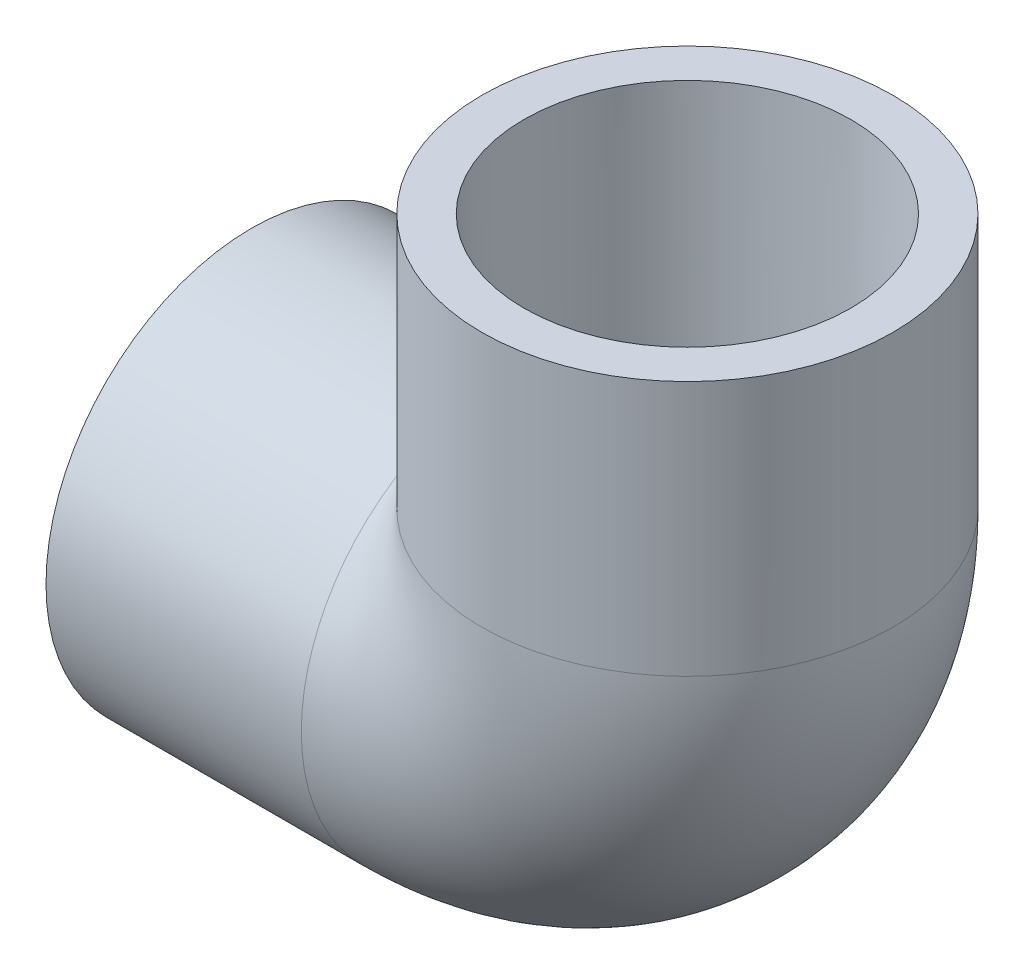
ISO-10303-21;
HEADER;
FILE_DESCRIPTION(('STEP AP214'),'2;1');
FILE_NAME('part.step','',(''),(''),'','','');
FILE_SCHEMA(('AUTOMOTIVE_DESIGN { 1 0 10303 214 1 1 1 1 }'));
ENDSEC;
DATA;
#1=APPLICATION_CONTEXT('core data for automotive mechanical design processes');
#2=APPLICATION_PROTOCOL_DEFINITION('international standard','automotive_design',2000,#1);
#3=PRODUCT_CONTEXT('',#1,'mechanical');
#4=PRODUCT('Part','Part','',(#3));
#5=PRODUCT_RELATED_PRODUCT_CATEGORY('part','',(#4));
#6=PRODUCT_DEFINITION_FORMATION('','',#4);
#7=PRODUCT_DEFINITION_CONTEXT('part definition',#1,'design');
#8=PRODUCT_DEFINITION('design','',#6,#7);
#9=PRODUCT_DEFINITION_SHAPE('','',#8);
#10=(LENGTH_UNIT() NAMED_UNIT(*) SI_UNIT(.MILLI.,.METRE.));
#11=(NAMED_UNIT(*) PLANE_ANGLE_UNIT() SI_UNIT($,.RADIAN.));
#12=(NAMED_UNIT(*) SI_UNIT($,.STERADIAN.) SOLID_ANGLE_UNIT());
#13=UNCERTAINTY_MEASURE_WITH_UNIT(LENGTH_MEASURE(1.E-05),#10,'distance_accuracy_value','');
#14=(GEOMETRIC_REPRESENTATION_CONTEXT(3) GLOBAL_UNCERTAINTY_ASSIGNED_CONTEXT((#13)) GLOBAL_UNIT_ASSIGNED_CONTEXT((#10,
#11,#12)) REPRESENTATION_CONTEXT('',''));
#15=CARTESIAN_POINT('',(0.,0.,0.));
#16=DIRECTION('',(0.,0.,1.));
#17=DIRECTION('',(1.,0.,0.));
#18=AXIS2_PLACEMENT_3D('',#15,#16,#17);
#19=CARTESIAN_POINT('',(-14.732,0.,0.));
#20=DIRECTION('',(-1.,0.,0.));
#21=DIRECTION('',(0.,0.,1.));
#22=AXIS2_PLACEMENT_3D('',#19,#20,#21);
#23=CONICAL_SURFACE('',#22,12.6873,0.0310875424032909);
#24=CARTESIAN_POINT('',(-35.56,0.,0.));
#25=DIRECTION('',(-1.,0.,0.));
#26=DIRECTION('',(0.,0.,1.));
#27=AXIS2_PLACEMENT_3D('',#24,#25,#26);
#28=CIRCLE('',#27,13.335);
#29=CARTESIAN_POINT('',(-35.56,0.,13.335));
#30=VERTEX_POINT('',#29);
#31=EDGE_CURVE('E53',#30,#30,#28,.T.);
#32=ORIENTED_EDGE('',*,*,#31,.T.);
#33=EDGE_LOOP('',(#32));
#34=FACE_BOUND('',#33,.T.);
#35=CARTESIAN_POINT('',(-14.732,0.,0.));
#36=DIRECTION('',(-1.,0.,0.));
#37=DIRECTION('',(0.,0.,1.));
#38=AXIS2_PLACEMENT_3D('',#35,#36,#37);
#39=CIRCLE('',#38,12.6873);
#40=CARTESIAN_POINT('',(-14.732,-12.6873,0.));
#41=VERTEX_POINT('',#40);
#42=EDGE_CURVE('E11',#41,#41,#39,.T.);
#43=ORIENTED_EDGE('',*,*,#42,.F.);
#44=EDGE_LOOP('',(#43));
#45=FACE_BOUND('',#44,.T.);
#46=ADVANCED_FACE('F33',(#34,#45),#23,.F.);
#47=CARTESIAN_POINT('',(-35.56,0.,0.));
#48=DIRECTION('',(-1.,0.,0.));
#49=DIRECTION('',(0.,0.,1.));
#50=AXIS2_PLACEMENT_3D('',#47,#48,#49);
#51=CYLINDRICAL_SURFACE('',#50,16.764);
#52=CARTESIAN_POINT('',(0.,0.,0.));
#53=DIRECTION('',(-0.707106781186547,-0.707106781186547,0.));
#54=DIRECTION('',(-0.707106781186547,0.707106781186547,0.));
#55=AXIS2_PLACEMENT_3D('',#52,#53,#54);
#56=ELLIPSE('',#55,23.7078761596226,16.764);
#57=CARTESIAN_POINT('',(-14.732,14.732,-7.99999199999601));
#58=VERTEX_POINT('',#57);
#59=CARTESIAN_POINT('',(-14.732,14.732,7.99999199999601));
#60=VERTEX_POINT('',#59);
#61=EDGE_CURVE('E52',#58,#60,#56,.F.);
#62=ORIENTED_EDGE('',*,*,#61,.F.);
#63=CARTESIAN_POINT('',(-14.732,0.,0.));
#64=DIRECTION('',(-1.,0.,0.));
#65=DIRECTION('',(0.,0.,1.));
#66=AXIS2_PLACEMENT_3D('',#63,#64,#65);
#67=CIRCLE('',#66,16.764);
#68=EDGE_CURVE('E40',#58,#60,#67,.T.);
#69=ORIENTED_EDGE('',*,*,#68,.T.);
#70=EDGE_LOOP('',(#62,#69));
#71=FACE_BOUND('',#70,.T.);
#72=CARTESIAN_POINT('',(-35.56,0.,0.));
#73=DIRECTION('',(-1.,0.,0.));
#74=DIRECTION('',(0.,0.,1.));
#75=AXIS2_PLACEMENT_3D('',#72,#73,#74);
#76=CIRCLE('',#75,16.764);
#77=CARTESIAN_POINT('',(-35.56,0.,16.764));
#78=VERTEX_POINT('',#77);
#79=EDGE_CURVE('E62',#78,#78,#76,.T.);
#80=ORIENTED_EDGE('',*,*,#79,.F.);
#81=EDGE_LOOP('',(#80));
#82=FACE_BOUND('',#81,.T.);
#83=ADVANCED_FACE('F57',(#71,#82),#51,.T.);
#84=CARTESIAN_POINT('',(-35.56,-16.764,0.));
#85=DIRECTION('',(-1.,0.,0.));
#86=DIRECTION('',(0.,0.,1.));
#87=AXIS2_PLACEMENT_3D('',#84,#85,#86);
#88=PLANE('',#87);
#89=ORIENTED_EDGE('',*,*,#79,.T.);
#90=EDGE_LOOP('',(#89));
#91=FACE_BOUND('',#90,.T.);
#92=ORIENTED_EDGE('',*,*,#31,.F.);
#93=EDGE_LOOP('',(#92));
#94=FACE_BOUND('',#93,.T.);
#95=ADVANCED_FACE('F97',(#91,#94),#88,.T.);
#96=CARTESIAN_POINT('',(-14.732,14.732,0.));
#97=DIRECTION('',(0.,0.,-1.));
#98=DIRECTION('',(-1.,0.,0.));
#99=AXIS2_PLACEMENT_3D('',#96,#97,#98);
#100=TOROIDAL_SURFACE('',#99,14.732,12.6873);
#101=CARTESIAN_POINT('',(0.,14.732,0.));
#102=DIRECTION('',(0.,-1.,0.));
#103=DIRECTION('',(0.,0.,-1.));
#104=AXIS2_PLACEMENT_3D('',#101,#102,#103);
#105=CIRCLE('',#104,12.6873);
#106=CARTESIAN_POINT('',(12.6873,14.732,0.));
#107=VERTEX_POINT('',#106);
#108=EDGE_CURVE('E54',#107,#107,#105,.T.);
#109=CARTESIAN_POINT('',(-14.732,14.732,0.));
#110=DIRECTION('',(0.,0.,-1.));
#111=DIRECTION('',(-1.,0.,0.));
#112=AXIS2_PLACEMENT_3D('',#109,#110,#111);
#113=CIRCLE('',#112,27.4193);
#114=EDGE_CURVE('',#107,#41,#113,.T.);
#115=ORIENTED_EDGE('',*,*,#108,.F.);
#116=ORIENTED_EDGE('',*,*,#42,.T.);
#117=ORIENTED_EDGE('',*,*,#114,.T.);
#118=ORIENTED_EDGE('',*,*,#114,.F.);
#119=EDGE_LOOP('',(#115,#117,#116,#118));
#120=FACE_BOUND('',#119,.T.);
#121=ADVANCED_FACE('F102',(#120),#100,.F.);
#122=CARTESIAN_POINT('',(-29.464,14.732,0.));
#123=DIRECTION('',(0.,-1.,0.));
#124=DIRECTION('',(-1.,0.,0.));
#125=AXIS2_PLACEMENT_3D('',#122,#123,#124);
#126=CIRCLE('',#125,16.764);
#127=TRIMMED_CURVE('',#126,(PARAMETER_VALUE(-2.64411255367123)),
(PARAMETER_VALUE(2.64411255367123)),.T.,.PARAMETER.);
#128=CARTESIAN_POINT('',(-14.732,14.732,0.));
#129=DIRECTION('',(0.,0.,-1.));
#130=AXIS1_PLACEMENT('',#128,#129);
#131=SURFACE_OF_REVOLUTION('',#127,#130);
#132=CARTESIAN_POINT('',(0.,14.732,0.));
#133=DIRECTION('',(0.,1.,0.));
#134=DIRECTION('',(0.,0.,-1.));
#135=AXIS2_PLACEMENT_3D('',#132,#133,#134);
#136=CIRCLE('',#135,16.764);
#137=EDGE_CURVE('E46',#60,#58,#136,.T.);
#138=ORIENTED_EDGE('',*,*,#137,.F.);
#139=ORIENTED_EDGE('',*,*,#68,.F.);
#140=EDGE_LOOP('',(#138,#139));
#141=FACE_BOUND('',#140,.T.);
#142=ADVANCED_FACE('F61',(#141),#131,.T.);
#143=CARTESIAN_POINT('',(16.764,35.56,0.));
#144=DIRECTION('',(0.,1.,0.));
#145=DIRECTION('',(0.,0.,1.));
#146=AXIS2_PLACEMENT_3D('',#143,#144,#145);
#147=PLANE('',#146);
#148=CARTESIAN_POINT('',(0.,35.56,0.));
#149=DIRECTION('',(0.,-1.,0.));
#150=DIRECTION('',(0.,0.,-1.));
#151=AXIS2_PLACEMENT_3D('',#148,#149,#150);
#152=CIRCLE('',#151,13.335);
#153=CARTESIAN_POINT('',(0.,35.56,-13.335));
#154=VERTEX_POINT('',#153);
#155=EDGE_CURVE('E75',#154,#154,#152,.T.);
#156=ORIENTED_EDGE('',*,*,#155,.T.);
#157=EDGE_LOOP('',(#156));
#158=FACE_BOUND('',#157,.T.);
#159=CARTESIAN_POINT('',(0.,35.56,0.));
#160=DIRECTION('',(0.,-1.,0.));
#161=DIRECTION('',(0.,0.,-1.));
#162=AXIS2_PLACEMENT_3D('',#159,#160,#161);
#163=CIRCLE('',#162,16.764);
#164=CARTESIAN_POINT('',(0.,35.56,-16.764));
#165=VERTEX_POINT('',#164);
#166=EDGE_CURVE('E59',#165,#165,#163,.T.);
#167=ORIENTED_EDGE('',*,*,#166,.F.);
#168=EDGE_LOOP('',(#167));
#169=FACE_BOUND('',#168,.T.);
#170=ADVANCED_FACE('F79',(#158,#169),#147,.T.);
#171=CARTESIAN_POINT('',(0.,0.,0.));
#172=DIRECTION('',(0.,-1.,0.));
#173=DIRECTION('',(0.,0.,-1.));
#174=AXIS2_PLACEMENT_3D('',#171,#172,#173);
#175=CYLINDRICAL_SURFACE('',#174,16.764);
#176=ORIENTED_EDGE('',*,*,#166,.T.);
#177=EDGE_LOOP('',(#176));
#178=FACE_BOUND('',#177,.T.);
#179=ORIENTED_EDGE('',*,*,#137,.T.);
#180=ORIENTED_EDGE('',*,*,#61,.T.);
#181=EDGE_LOOP('',(#179,#180));
#182=FACE_BOUND('',#181,.T.);
#183=ADVANCED_FACE('F51',(#178,#182),#175,.T.);
#184=CARTESIAN_POINT('',(12.6865182799584,14.732,0.));
#185=DIRECTION('',(0.,-1.,0.));
#186=DIRECTION('',(0.,0.,-1.));
#187=AXIS2_PLACEMENT_3D('',#184,#185,#186);
#188=PLANE('',#187);
#189=ORIENTED_EDGE('',*,*,#108,.T.);
#190=EDGE_LOOP('',(#189));
#191=FACE_BOUND('',#190,.T.);
#192=CARTESIAN_POINT('',(0.,14.732,0.));
#193=DIRECTION('',(0.,-1.,0.));
#194=DIRECTION('',(0.,0.,-1.));
#195=AXIS2_PLACEMENT_3D('',#192,#193,#194);
#196=CIRCLE('',#195,12.6865182799584);
#197=CARTESIAN_POINT('',(0.,14.732,-12.6865182799584));
#198=VERTEX_POINT('',#197);
#199=EDGE_CURVE('E72',#198,#198,#196,.T.);
#200=ORIENTED_EDGE('',*,*,#199,.F.);
#201=EDGE_LOOP('',(#200));
#202=FACE_BOUND('',#201,.T.);
#203=ADVANCED_FACE('F84',(#191,#202),#188,.T.);
#204=CARTESIAN_POINT('',(0.,35.56,0.));
#205=DIRECTION('',(0.,1.,0.));
#206=DIRECTION('',(0.,0.,1.));
#207=AXIS2_PLACEMENT_3D('',#204,#205,#206);
#208=CONICAL_SURFACE('',#207,13.335,0.0311250382690548);
#209=ORIENTED_EDGE('',*,*,#199,.T.);
#210=EDGE_LOOP('',(#209));
#211=FACE_BOUND('',#210,.T.);
#212=ORIENTED_EDGE('',*,*,#155,.F.);
#213=EDGE_LOOP('',(#212));
#214=FACE_BOUND('',#213,.T.);
#215=ADVANCED_FACE('F82',(#211,#214),#208,.F.);
#216=CLOSED_SHELL('',(#46,#83,#95,#121,#142,#170,#183,#203,#215));
#217=MANIFOLD_SOLID_BREP('B2',#216);
#218=ADVANCED_BREP_SHAPE_REPRESENTATION('',(#18,#217),#14);
#219=SHAPE_DEFINITION_REPRESENTATION(#9,#218);
ENDSEC;
END-ISO-10303-21;
